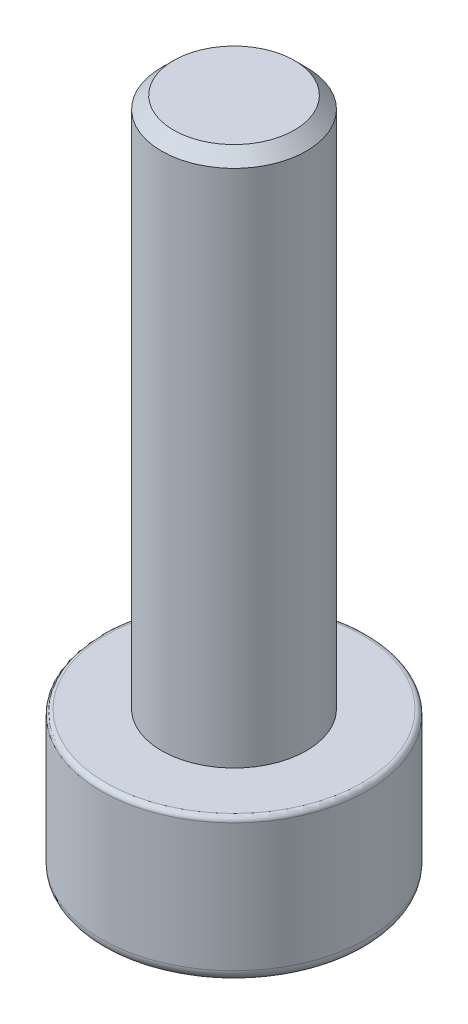
ISO-10303-21;
HEADER;
FILE_DESCRIPTION(('STEP AP214'),'2;1');
FILE_NAME('part.step','',(''),(''),'','','');
FILE_SCHEMA(('AUTOMOTIVE_DESIGN { 1 0 10303 214 1 1 1 1 }'));
ENDSEC;
DATA;
#1=APPLICATION_CONTEXT('core data for automotive mechanical design processes');
#2=APPLICATION_PROTOCOL_DEFINITION('international standard','automotive_design',2000,#1);
#3=PRODUCT_CONTEXT('',#1,'mechanical');
#4=PRODUCT('Part','Part','',(#3));
#5=PRODUCT_RELATED_PRODUCT_CATEGORY('part','',(#4));
#6=PRODUCT_DEFINITION_FORMATION('','',#4);
#7=PRODUCT_DEFINITION_CONTEXT('part definition',#1,'design');
#8=PRODUCT_DEFINITION('design','',#6,#7);
#9=PRODUCT_DEFINITION_SHAPE('','',#8);
#10=(LENGTH_UNIT() NAMED_UNIT(*) SI_UNIT(.MILLI.,.METRE.));
#11=(NAMED_UNIT(*) PLANE_ANGLE_UNIT() SI_UNIT($,.RADIAN.));
#12=(NAMED_UNIT(*) SI_UNIT($,.STERADIAN.) SOLID_ANGLE_UNIT());
#13=UNCERTAINTY_MEASURE_WITH_UNIT(LENGTH_MEASURE(1.E-05),#10,'distance_accuracy_value','');
#14=(GEOMETRIC_REPRESENTATION_CONTEXT(3) GLOBAL_UNCERTAINTY_ASSIGNED_CONTEXT((#13)) GLOBAL_UNIT_ASSIGNED_CONTEXT((#10,
#11,#12)) REPRESENTATION_CONTEXT('',''));
#15=CARTESIAN_POINT('',(0.,0.,0.));
#16=DIRECTION('',(0.,0.,1.));
#17=DIRECTION('',(1.,0.,0.));
#18=AXIS2_PLACEMENT_3D('',#15,#16,#17);
#19=CARTESIAN_POINT('',(0.,3.,0.));
#20=DIRECTION('',(0.,-1.,0.));
#21=DIRECTION('',(0.,0.,-1.));
#22=AXIS2_PLACEMENT_3D('',#19,#20,#21);
#23=CYLINDRICAL_SURFACE('',#22,2.75);
#24=CARTESIAN_POINT('',(0.,2.9,0.));
#25=DIRECTION('',(0.,1.,0.));
#26=DIRECTION('',(0.,0.,1.));
#27=AXIS2_PLACEMENT_3D('',#24,#25,#26);
#28=CIRCLE('',#27,2.75);
#29=CARTESIAN_POINT('',(0.,2.9,2.75));
#30=VERTEX_POINT('',#29);
#31=EDGE_CURVE('E11',#30,#30,#28,.F.);
#32=ORIENTED_EDGE('',*,*,#31,.T.);
#33=EDGE_LOOP('',(#32));
#34=FACE_BOUND('',#33,.T.);
#35=CARTESIAN_POINT('',(0.,0.25,0.));
#36=DIRECTION('',(0.,1.,0.));
#37=DIRECTION('',(0.,0.,1.));
#38=AXIS2_PLACEMENT_3D('',#35,#36,#37);
#39=CIRCLE('',#38,2.75);
#40=CARTESIAN_POINT('',(0.,0.25,2.75));
#41=VERTEX_POINT('',#40);
#42=EDGE_CURVE('E177',#41,#41,#39,.T.);
#43=ORIENTED_EDGE('',*,*,#42,.T.);
#44=EDGE_LOOP('',(#43));
#45=FACE_BOUND('',#44,.T.);
#46=ADVANCED_FACE('F33',(#34,#45),#23,.T.);
#47=CARTESIAN_POINT('',(0.,3.,0.));
#48=DIRECTION('',(0.,1.,0.));
#49=DIRECTION('',(0.,0.,1.));
#50=AXIS2_PLACEMENT_3D('',#47,#48,#49);
#51=PLANE('',#50);
#52=CARTESIAN_POINT('',(0.,3.,0.));
#53=DIRECTION('',(0.,1.,0.));
#54=DIRECTION('',(0.,0.,1.));
#55=AXIS2_PLACEMENT_3D('',#52,#53,#54);
#56=CIRCLE('',#55,2.65);
#57=CARTESIAN_POINT('',(0.,3.,2.65));
#58=VERTEX_POINT('',#57);
#59=EDGE_CURVE('E41',#58,#58,#56,.T.);
#60=ORIENTED_EDGE('',*,*,#59,.T.);
#61=EDGE_LOOP('',(#60));
#62=FACE_BOUND('',#61,.T.);
#63=CARTESIAN_POINT('',(0.,3.,0.));
#64=DIRECTION('',(0.,1.,0.));
#65=DIRECTION('',(0.,0.,1.));
#66=AXIS2_PLACEMENT_3D('',#63,#64,#65);
#67=CIRCLE('',#66,1.5);
#68=CARTESIAN_POINT('',(0.,3.,1.5));
#69=VERTEX_POINT('',#68);
#70=EDGE_CURVE('E141',#69,#69,#67,.T.);
#71=ORIENTED_EDGE('',*,*,#70,.F.);
#72=EDGE_LOOP('',(#71));
#73=FACE_BOUND('',#72,.T.);
#74=ADVANCED_FACE('F203',(#62,#73),#51,.T.);
#75=CARTESIAN_POINT('',(0.,0.,0.));
#76=DIRECTION('',(0.,1.,0.));
#77=DIRECTION('',(0.,0.,1.));
#78=AXIS2_PLACEMENT_3D('',#75,#76,#77);
#79=PLANE('',#78);
#80=CARTESIAN_POINT('',(0.,0.,0.));
#81=DIRECTION('',(0.,1.,0.));
#82=DIRECTION('',(0.,0.,1.));
#83=AXIS2_PLACEMENT_3D('',#80,#81,#82);
#84=CIRCLE('',#83,2.5);
#85=CARTESIAN_POINT('',(0.,0.,2.5));
#86=VERTEX_POINT('',#85);
#87=EDGE_CURVE('E192',#86,#86,#84,.F.);
#88=ORIENTED_EDGE('',*,*,#87,.T.);
#89=EDGE_LOOP('',(#88));
#90=FACE_BOUND('',#89,.T.);
#91=DIRECTION('',(-0.69197693122312,0.,-0.721919612321922));
#92=VECTOR('',#91,1.);
#93=CARTESIAN_POINT('',(1.02450088015783,0.,-0.982008194523007));
#94=LINE('',#93,#92);
#95=CARTESIAN_POINT('',(1.59146357561211,0.,-0.390512335578875));
#96=VERTEX_POINT('',#95);
#97=CARTESIAN_POINT('',(0.457538184703553,0.,-1.57350405346714));
#98=VERTEX_POINT('',#97);
#99=EDGE_CURVE('E156',#96,#98,#94,.T.);
#100=ORIENTED_EDGE('',*,*,#99,.T.);
#101=DIRECTION('',(-0.971189189372558,0.,0.238309795111058));
#102=VECTOR('',#101,1.);
#103=CARTESIAN_POINT('',(-0.3381936031025,0.,-1.3782478856777));
#104=LINE('',#103,#102);
#105=CARTESIAN_POINT('',(-1.13392539090855,0.,-1.18299171788826));
#106=VERTEX_POINT('',#105);
#107=EDGE_CURVE('E166',#98,#106,#104,.T.);
#108=ORIENTED_EDGE('',*,*,#107,.T.);
#109=DIRECTION('',(-0.279212258149438,0.,0.96022940743298));
#110=VECTOR('',#109,1.);
#111=CARTESIAN_POINT('',(-1.36269448326033,0.,-0.396239691154693));
#112=LINE('',#111,#110);
#113=CARTESIAN_POINT('',(-1.59146357561211,0.,0.390512335578876));
#114=VERTEX_POINT('',#113);
#115=EDGE_CURVE('E164',#106,#114,#112,.T.);
#116=ORIENTED_EDGE('',*,*,#115,.T.);
#117=DIRECTION('',(0.69197693122312,0.,0.721919612321922));
#118=VECTOR('',#117,1.);
#119=CARTESIAN_POINT('',(-1.02450088015783,0.,0.982008194523007));
#120=LINE('',#119,#118);
#121=CARTESIAN_POINT('',(-0.457538184703552,0.,1.57350405346714));
#122=VERTEX_POINT('',#121);
#123=EDGE_CURVE('E162',#114,#122,#120,.T.);
#124=ORIENTED_EDGE('',*,*,#123,.T.);
#125=DIRECTION('',(0.971189189372558,0.,-0.238309795111058));
#126=VECTOR('',#125,1.);
#127=CARTESIAN_POINT('',(0.3381936031025,0.,1.3782478856777));
#128=LINE('',#127,#126);
#129=CARTESIAN_POINT('',(1.13392539090855,0.,1.18299171788826));
#130=VERTEX_POINT('',#129);
#131=EDGE_CURVE('E160',#122,#130,#128,.T.);
#132=ORIENTED_EDGE('',*,*,#131,.T.);
#133=DIRECTION('',(0.279212258149438,0.,-0.96022940743298));
#134=VECTOR('',#133,1.);
#135=CARTESIAN_POINT('',(1.36269448326033,0.,0.396239691154694));
#136=LINE('',#135,#134);
#137=EDGE_CURVE('E158',#130,#96,#136,.T.);
#138=ORIENTED_EDGE('',*,*,#137,.T.);
#139=EDGE_LOOP('',(#100,#108,#116,#124,#132,#138));
#140=FACE_BOUND('',#139,.T.);
#141=ADVANCED_FACE('F221',(#90,#140),#79,.F.);
#142=CARTESIAN_POINT('',(0.,14.,0.));
#143=DIRECTION('',(0.,-1.,0.));
#144=DIRECTION('',(0.,0.,-1.));
#145=AXIS2_PLACEMENT_3D('',#142,#143,#144);
#146=CYLINDRICAL_SURFACE('',#145,1.5);
#147=CARTESIAN_POINT('',(0.,13.75,0.));
#148=DIRECTION('',(0.,1.,0.));
#149=DIRECTION('',(0.,0.,1.));
#150=AXIS2_PLACEMENT_3D('',#147,#148,#149);
#151=CIRCLE('',#150,1.5);
#152=CARTESIAN_POINT('',(0.,13.75,1.5));
#153=VERTEX_POINT('',#152);
#154=EDGE_CURVE('E198',#153,#153,#151,.F.);
#155=ORIENTED_EDGE('',*,*,#154,.T.);
#156=EDGE_LOOP('',(#155));
#157=FACE_BOUND('',#156,.T.);
#158=ORIENTED_EDGE('',*,*,#70,.T.);
#159=EDGE_LOOP('',(#158));
#160=FACE_BOUND('',#159,.T.);
#161=ADVANCED_FACE('F260',(#157,#160),#146,.T.);
#162=CARTESIAN_POINT('',(0.,14.,0.));
#163=DIRECTION('',(0.,1.,0.));
#164=DIRECTION('',(0.,0.,1.));
#165=AXIS2_PLACEMENT_3D('',#162,#163,#164);
#166=PLANE('',#165);
#167=CARTESIAN_POINT('',(0.,14.,0.));
#168=DIRECTION('',(0.,1.,0.));
#169=DIRECTION('',(0.,0.,1.));
#170=AXIS2_PLACEMENT_3D('',#167,#168,#169);
#171=CIRCLE('',#170,1.25);
#172=CARTESIAN_POINT('',(0.,14.,1.25));
#173=VERTEX_POINT('',#172);
#174=EDGE_CURVE('E195',#173,#173,#171,.T.);
#175=ORIENTED_EDGE('',*,*,#174,.T.);
#176=EDGE_LOOP('',(#175));
#177=FACE_BOUND('',#176,.T.);
#178=ADVANCED_FACE('F299',(#177),#166,.T.);
#179=CARTESIAN_POINT('',(1.31110540565295,1.5,-0.321718223399928));
#180=DIRECTION('',(0.96022940743298,0.,0.279212258149438));
#181=DIRECTION('',(0.279212258149438,0.,-0.96022940743298));
#182=AXIS2_PLACEMENT_3D('',#179,#180,#181);
#183=PLANE('',#182);
#184=DIRECTION('',(0.,-1.,0.));
#185=VECTOR('',#184,1.);
#186=CARTESIAN_POINT('',(1.31110540565295,1.5,-0.321718223399928));
#187=LINE('',#186,#185);
#188=CARTESIAN_POINT('',(1.31110540565295,1.5,-0.321718223399928));
#189=VERTEX_POINT('',#188);
#190=CARTESIAN_POINT('',(1.31110540565295,0.25,-0.321718223399928));
#191=VERTEX_POINT('',#190);
#192=EDGE_CURVE('E139',#189,#191,#187,.T.);
#193=ORIENTED_EDGE('',*,*,#192,.T.);
#194=DIRECTION('',(-0.279212258149438,0.,0.96022940743298));
#195=VECTOR('',#194,1.);
#196=CARTESIAN_POINT('',(1.31110540565295,0.25,-0.321718223399928));
#197=LINE('',#196,#195);
#198=CARTESIAN_POINT('',(0.934168857151212,0.25,0.974591476634595));
#199=VERTEX_POINT('',#198);
#200=EDGE_CURVE('E55',#191,#199,#197,.T.);
#201=ORIENTED_EDGE('',*,*,#200,.T.);
#202=DIRECTION('',(0.,-1.,0.));
#203=VECTOR('',#202,1.);
#204=CARTESIAN_POINT('',(0.934168857151212,1.5,0.974591476634595));
#205=LINE('',#204,#203);
#206=CARTESIAN_POINT('',(0.934168857151212,1.5,0.974591476634595));
#207=VERTEX_POINT('',#206);
#208=EDGE_CURVE('E103',#207,#199,#205,.T.);
#209=ORIENTED_EDGE('',*,*,#208,.F.);
#210=DIRECTION('',(-0.279212258149438,0.,0.96022940743298));
#211=VECTOR('',#210,1.);
#212=CARTESIAN_POINT('',(1.31110540565295,1.5,-0.321718223399928));
#213=LINE('',#212,#211);
#214=EDGE_CURVE('E107',#189,#207,#213,.T.);
#215=ORIENTED_EDGE('',*,*,#214,.F.);
#216=EDGE_LOOP('',(#193,#201,#209,#215));
#217=FACE_BOUND('',#216,.T.);
#218=ADVANCED_FACE('F105',(#217),#183,.F.);
#219=CARTESIAN_POINT('',(0.376936548501741,1.5,-1.29630970003452));
#220=DIRECTION('',(0.721919612321922,0.,-0.69197693122312));
#221=DIRECTION('',(-0.69197693122312,0.,-0.721919612321922));
#222=AXIS2_PLACEMENT_3D('',#219,#220,#221);
#223=PLANE('',#222);
#224=DIRECTION('',(0.,-1.,0.));
#225=VECTOR('',#224,1.);
#226=CARTESIAN_POINT('',(0.376936548501741,1.5,-1.29630970003452));
#227=LINE('',#226,#225);
#228=CARTESIAN_POINT('',(0.376936548501741,1.5,-1.29630970003452));
#229=VERTEX_POINT('',#228);
#230=CARTESIAN_POINT('',(0.376936548501741,0.25,-1.29630970003452));
#231=VERTEX_POINT('',#230);
#232=EDGE_CURVE('E142',#229,#231,#227,.T.);
#233=ORIENTED_EDGE('',*,*,#232,.T.);
#234=DIRECTION('',(0.69197693122312,0.,0.721919612321922));
#235=VECTOR('',#234,1.);
#236=CARTESIAN_POINT('',(0.376936548501741,0.25,-1.29630970003452));
#237=LINE('',#236,#235);
#238=EDGE_CURVE('E48',#231,#191,#237,.T.);
#239=ORIENTED_EDGE('',*,*,#238,.T.);
#240=ORIENTED_EDGE('',*,*,#192,.F.);
#241=DIRECTION('',(0.69197693122312,0.,0.721919612321922));
#242=VECTOR('',#241,1.);
#243=CARTESIAN_POINT('',(0.376936548501741,1.5,-1.29630970003452));
#244=LINE('',#243,#242);
#245=EDGE_CURVE('E112',#229,#189,#244,.T.);
#246=ORIENTED_EDGE('',*,*,#245,.F.);
#247=EDGE_LOOP('',(#233,#239,#240,#246));
#248=FACE_BOUND('',#247,.T.);
#249=ADVANCED_FACE('F272',(#248),#223,.F.);
#250=CARTESIAN_POINT('',(-0.934168857151211,1.5,-0.974591476634595));
#251=DIRECTION('',(-0.238309795111058,0.,-0.971189189372557));
#252=DIRECTION('',(-0.971189189372558,0.,0.238309795111058));
#253=AXIS2_PLACEMENT_3D('',#250,#251,#252);
#254=PLANE('',#253);
#255=DIRECTION('',(0.,-1.,0.));
#256=VECTOR('',#255,1.);
#257=CARTESIAN_POINT('',(-0.934168857151211,1.5,-0.974591476634595));
#258=LINE('',#257,#256);
#259=CARTESIAN_POINT('',(-0.934168857151211,1.5,-0.974591476634595));
#260=VERTEX_POINT('',#259);
#261=CARTESIAN_POINT('',(-0.934168857151211,0.25,-0.974591476634595));
#262=VERTEX_POINT('',#261);
#263=EDGE_CURVE('E144',#260,#262,#258,.T.);
#264=ORIENTED_EDGE('',*,*,#263,.T.);
#265=DIRECTION('',(0.971189189372558,0.,-0.238309795111058));
#266=VECTOR('',#265,1.);
#267=CARTESIAN_POINT('',(-0.934168857151211,0.25,-0.974591476634595));
#268=LINE('',#267,#266);
#269=EDGE_CURVE('E153',#262,#231,#268,.T.);
#270=ORIENTED_EDGE('',*,*,#269,.T.);
#271=ORIENTED_EDGE('',*,*,#232,.F.);
#272=DIRECTION('',(0.971189189372558,0.,-0.238309795111058));
#273=VECTOR('',#272,1.);
#274=CARTESIAN_POINT('',(-0.934168857151211,1.5,-0.974591476634595));
#275=LINE('',#274,#273);
#276=EDGE_CURVE('E136',#260,#229,#275,.T.);
#277=ORIENTED_EDGE('',*,*,#276,.F.);
#278=EDGE_LOOP('',(#264,#270,#271,#277));
#279=FACE_BOUND('',#278,.T.);
#280=ADVANCED_FACE('F270',(#279),#254,.F.);
#281=CARTESIAN_POINT('',(-1.31110540565295,1.5,0.321718223399928));
#282=DIRECTION('',(-0.96022940743298,0.,-0.279212258149438));
#283=DIRECTION('',(-0.279212258149438,0.,0.96022940743298));
#284=AXIS2_PLACEMENT_3D('',#281,#282,#283);
#285=PLANE('',#284);
#286=DIRECTION('',(0.,-1.,0.));
#287=VECTOR('',#286,1.);
#288=CARTESIAN_POINT('',(-1.31110540565295,1.5,0.321718223399928));
#289=LINE('',#288,#287);
#290=CARTESIAN_POINT('',(-1.31110540565295,1.5,0.321718223399928));
#291=VERTEX_POINT('',#290);
#292=CARTESIAN_POINT('',(-1.31110540565295,0.25,0.321718223399928));
#293=VERTEX_POINT('',#292);
#294=EDGE_CURVE('E147',#291,#293,#289,.T.);
#295=ORIENTED_EDGE('',*,*,#294,.T.);
#296=DIRECTION('',(0.279212258149438,0.,-0.96022940743298));
#297=VECTOR('',#296,1.);
#298=CARTESIAN_POINT('',(-1.31110540565295,0.25,0.321718223399928));
#299=LINE('',#298,#297);
#300=EDGE_CURVE('E169',#293,#262,#299,.T.);
#301=ORIENTED_EDGE('',*,*,#300,.T.);
#302=ORIENTED_EDGE('',*,*,#263,.F.);
#303=DIRECTION('',(0.279212258149438,0.,-0.96022940743298));
#304=VECTOR('',#303,1.);
#305=CARTESIAN_POINT('',(-1.31110540565295,1.5,0.321718223399928));
#306=LINE('',#305,#304);
#307=EDGE_CURVE('E133',#291,#260,#306,.T.);
#308=ORIENTED_EDGE('',*,*,#307,.F.);
#309=EDGE_LOOP('',(#295,#301,#302,#308));
#310=FACE_BOUND('',#309,.T.);
#311=ADVANCED_FACE('F281',(#310),#285,.F.);
#312=CARTESIAN_POINT('',(-0.376936548501741,1.5,1.29630970003452));
#313=DIRECTION('',(-0.721919612321922,0.,0.69197693122312));
#314=DIRECTION('',(0.69197693122312,0.,0.721919612321922));
#315=AXIS2_PLACEMENT_3D('',#312,#313,#314);
#316=PLANE('',#315);
#317=DIRECTION('',(0.,-1.,0.));
#318=VECTOR('',#317,1.);
#319=CARTESIAN_POINT('',(-0.376936548501741,1.5,1.29630970003452));
#320=LINE('',#319,#318);
#321=CARTESIAN_POINT('',(-0.376936548501741,1.5,1.29630970003452));
#322=VERTEX_POINT('',#321);
#323=CARTESIAN_POINT('',(-0.376936548501741,0.25,1.29630970003452));
#324=VERTEX_POINT('',#323);
#325=EDGE_CURVE('E111',#322,#324,#320,.T.);
#326=ORIENTED_EDGE('',*,*,#325,.T.);
#327=DIRECTION('',(-0.69197693122312,0.,-0.721919612321922));
#328=VECTOR('',#327,1.);
#329=CARTESIAN_POINT('',(-0.376936548501741,0.25,1.29630970003452));
#330=LINE('',#329,#328);
#331=EDGE_CURVE('E171',#324,#293,#330,.T.);
#332=ORIENTED_EDGE('',*,*,#331,.T.);
#333=ORIENTED_EDGE('',*,*,#294,.F.);
#334=DIRECTION('',(-0.69197693122312,0.,-0.721919612321922));
#335=VECTOR('',#334,1.);
#336=CARTESIAN_POINT('',(-0.376936548501741,1.5,1.29630970003452));
#337=LINE('',#336,#335);
#338=EDGE_CURVE('E121',#322,#291,#337,.T.);
#339=ORIENTED_EDGE('',*,*,#338,.F.);
#340=EDGE_LOOP('',(#326,#332,#333,#339));
#341=FACE_BOUND('',#340,.T.);
#342=ADVANCED_FACE('F278',(#341),#316,.F.);
#343=CARTESIAN_POINT('',(0.934168857151212,1.5,0.974591476634595));
#344=DIRECTION('',(0.238309795111058,0.,0.971189189372558));
#345=DIRECTION('',(0.971189189372558,0.,-0.238309795111058));
#346=AXIS2_PLACEMENT_3D('',#343,#344,#345);
#347=PLANE('',#346);
#348=ORIENTED_EDGE('',*,*,#208,.T.);
#349=DIRECTION('',(-0.971189189372558,0.,0.238309795111058));
#350=VECTOR('',#349,1.);
#351=CARTESIAN_POINT('',(0.934168857151212,0.25,0.974591476634595));
#352=LINE('',#351,#350);
#353=EDGE_CURVE('E173',#199,#324,#352,.T.);
#354=ORIENTED_EDGE('',*,*,#353,.T.);
#355=ORIENTED_EDGE('',*,*,#325,.F.);
#356=DIRECTION('',(-0.971189189372557,0.,0.238309795111058));
#357=VECTOR('',#356,1.);
#358=CARTESIAN_POINT('',(0.934168857151212,1.5,0.974591476634595));
#359=LINE('',#358,#357);
#360=EDGE_CURVE('E115',#207,#322,#359,.T.);
#361=ORIENTED_EDGE('',*,*,#360,.F.);
#362=EDGE_LOOP('',(#348,#354,#355,#361));
#363=FACE_BOUND('',#362,.T.);
#364=ADVANCED_FACE('F116',(#363),#347,.F.);
#365=CARTESIAN_POINT('',(0.,1.5,0.));
#366=DIRECTION('',(0.,-1.,0.));
#367=DIRECTION('',(0.,0.,-1.));
#368=AXIS2_PLACEMENT_3D('',#365,#366,#367);
#369=PLANE('',#368);
#370=ORIENTED_EDGE('',*,*,#214,.T.);
#371=ORIENTED_EDGE('',*,*,#360,.T.);
#372=ORIENTED_EDGE('',*,*,#338,.T.);
#373=ORIENTED_EDGE('',*,*,#307,.T.);
#374=ORIENTED_EDGE('',*,*,#276,.T.);
#375=ORIENTED_EDGE('',*,*,#245,.T.);
#376=EDGE_LOOP('',(#370,#371,#372,#373,#374,#375));
#377=FACE_BOUND('',#376,.T.);
#378=ADVANCED_FACE('F123',(#377),#369,.T.);
#379=CARTESIAN_POINT('',(0.934168857151212,0.25,0.974591476634595));
#380=DIRECTION('',(0.168510472146205,0.70710678118655,0.686734461620399));
#381=DIRECTION('',(-0.971189189372558,0.,0.238309795111058));
#382=AXIS2_PLACEMENT_3D('',#379,#380,#381);
#383=PLANE('',#382);
#384=DIRECTION('',(-0.52308539228858,0.654653670707974,-0.545719931652563));
#385=VECTOR('',#384,1.);
#386=CARTESIAN_POINT('',(0.934168857151212,0.25,0.974591476634595));
#387=LINE('',#386,#385);
#388=EDGE_CURVE('E129',#130,#199,#387,.T.);
#389=ORIENTED_EDGE('',*,*,#388,.F.);
#390=ORIENTED_EDGE('',*,*,#131,.F.);
#391=DIRECTION('',(0.211064628018338,0.654653670707974,-0.72586520389674));
#392=VECTOR('',#391,1.);
#393=CARTESIAN_POINT('',(-0.376936548501741,0.25,1.29630970003452));
#394=LINE('',#393,#392);
#395=EDGE_CURVE('E126',#324,#122,#394,.F.);
#396=ORIENTED_EDGE('',*,*,#395,.F.);
#397=ORIENTED_EDGE('',*,*,#353,.F.);
#398=EDGE_LOOP('',(#389,#390,#396,#397));
#399=FACE_BOUND('',#398,.T.);
#400=ADVANCED_FACE('F245',(#399),#383,.F.);
#401=CARTESIAN_POINT('',(-0.376936548501741,0.25,1.29630970003452));
#402=DIRECTION('',(-0.510474253344393,0.70710678118655,0.489301580492523));
#403=DIRECTION('',(-0.69197693122312,0.,-0.721919612321922));
#404=AXIS2_PLACEMENT_3D('',#401,#402,#403);
#405=PLANE('',#404);
#406=ORIENTED_EDGE('',*,*,#395,.T.);
#407=ORIENTED_EDGE('',*,*,#123,.F.);
#408=DIRECTION('',(0.734150020306917,0.654653670707974,-0.180145272244176));
#409=VECTOR('',#408,1.);
#410=CARTESIAN_POINT('',(-1.31110540565295,0.25,0.321718223399928));
#411=LINE('',#410,#409);
#412=EDGE_CURVE('E185',#293,#114,#411,.F.);
#413=ORIENTED_EDGE('',*,*,#412,.F.);
#414=ORIENTED_EDGE('',*,*,#331,.F.);
#415=EDGE_LOOP('',(#406,#407,#413,#414));
#416=FACE_BOUND('',#415,.T.);
#417=ADVANCED_FACE('F241',(#416),#405,.F.);
#418=CARTESIAN_POINT('',(1.31110540565295,0.25,-0.321718223399928));
#419=DIRECTION('',(0.678984725490597,0.707106781186551,0.197432881127876));
#420=DIRECTION('',(-0.279212258149438,0.,0.96022940743298));
#421=AXIS2_PLACEMENT_3D('',#418,#419,#420);
#422=PLANE('',#421);
#423=ORIENTED_EDGE('',*,*,#388,.T.);
#424=ORIENTED_EDGE('',*,*,#200,.F.);
#425=DIRECTION('',(-0.734150020306917,0.654653670707974,0.180145272244176));
#426=VECTOR('',#425,1.);
#427=CARTESIAN_POINT('',(1.31110540565295,0.25,-0.321718223399928));
#428=LINE('',#427,#426);
#429=EDGE_CURVE('E182',#96,#191,#428,.T.);
#430=ORIENTED_EDGE('',*,*,#429,.F.);
#431=ORIENTED_EDGE('',*,*,#137,.F.);
#432=EDGE_LOOP('',(#423,#424,#430,#431));
#433=FACE_BOUND('',#432,.T.);
#434=ADVANCED_FACE('F237',(#433),#422,.F.);
#435=CARTESIAN_POINT('',(-1.31110540565295,0.25,0.321718223399928));
#436=DIRECTION('',(-0.678984725490598,0.70710678118655,-0.197432881127876));
#437=DIRECTION('',(0.279212258149438,0.,-0.96022940743298));
#438=AXIS2_PLACEMENT_3D('',#435,#436,#437);
#439=PLANE('',#438);
#440=ORIENTED_EDGE('',*,*,#412,.T.);
#441=ORIENTED_EDGE('',*,*,#115,.F.);
#442=DIRECTION('',(0.523085392288579,0.654653670707974,0.545719931652563));
#443=VECTOR('',#442,1.);
#444=CARTESIAN_POINT('',(-0.934168857151211,0.25,-0.974591476634595));
#445=LINE('',#444,#443);
#446=EDGE_CURVE('E180',#262,#106,#445,.F.);
#447=ORIENTED_EDGE('',*,*,#446,.F.);
#448=ORIENTED_EDGE('',*,*,#300,.F.);
#449=EDGE_LOOP('',(#440,#441,#447,#448));
#450=FACE_BOUND('',#449,.T.);
#451=ADVANCED_FACE('F233',(#450),#439,.F.);
#452=CARTESIAN_POINT('',(0.376936548501741,0.25,-1.29630970003452));
#453=DIRECTION('',(0.510474253344392,0.70710678118655,-0.489301580492523));
#454=DIRECTION('',(0.69197693122312,0.,0.721919612321922));
#455=AXIS2_PLACEMENT_3D('',#452,#453,#454);
#456=PLANE('',#455);
#457=ORIENTED_EDGE('',*,*,#429,.T.);
#458=ORIENTED_EDGE('',*,*,#238,.F.);
#459=DIRECTION('',(0.211064628018338,-0.654653670707974,-0.72586520389674));
#460=VECTOR('',#459,1.);
#461=CARTESIAN_POINT('',(0.269240391786957,0.584038370031141,-0.925935500024657));
#462=LINE('',#461,#460);
#463=EDGE_CURVE('E178',#98,#231,#462,.F.);
#464=ORIENTED_EDGE('',*,*,#463,.F.);
#465=ORIENTED_EDGE('',*,*,#99,.F.);
#466=EDGE_LOOP('',(#457,#458,#464,#465));
#467=FACE_BOUND('',#466,.T.);
#468=ADVANCED_FACE('F229',(#467),#456,.F.);
#469=CARTESIAN_POINT('',(-0.934168857151211,0.25,-0.974591476634595));
#470=DIRECTION('',(-0.168510472146205,0.70710678118655,-0.686734461620399));
#471=DIRECTION('',(0.971189189372558,0.,-0.238309795111058));
#472=AXIS2_PLACEMENT_3D('',#469,#470,#471);
#473=PLANE('',#472);
#474=ORIENTED_EDGE('',*,*,#446,.T.);
#475=ORIENTED_EDGE('',*,*,#107,.F.);
#476=ORIENTED_EDGE('',*,*,#463,.T.);
#477=ORIENTED_EDGE('',*,*,#269,.F.);
#478=EDGE_LOOP('',(#474,#475,#476,#477));
#479=FACE_BOUND('',#478,.T.);
#480=ADVANCED_FACE('F226',(#479),#473,.F.);
#481=CARTESIAN_POINT('',(0.,0.25,0.));
#482=DIRECTION('',(0.,1.,0.));
#483=DIRECTION('',(0.,0.,1.));
#484=AXIS2_PLACEMENT_3D('',#481,#482,#483);
#485=TOROIDAL_SURFACE('',#484,2.5,0.25);
#486=ORIENTED_EDGE('',*,*,#87,.F.);
#487=EDGE_LOOP('',(#486));
#488=FACE_BOUND('',#487,.T.);
#489=ORIENTED_EDGE('',*,*,#42,.F.);
#490=EDGE_LOOP('',(#489));
#491=FACE_BOUND('',#490,.T.);
#492=ADVANCED_FACE('F212',(#488,#491),#485,.T.);
#493=CARTESIAN_POINT('',(0.,14.,0.));
#494=DIRECTION('',(0.,-1.,0.));
#495=DIRECTION('',(0.,0.,-1.));
#496=AXIS2_PLACEMENT_3D('',#493,#494,#495);
#497=CONICAL_SURFACE('',#496,1.25,0.78539816339745);
#498=ORIENTED_EDGE('',*,*,#154,.F.);
#499=EDGE_LOOP('',(#498));
#500=FACE_BOUND('',#499,.T.);
#501=ORIENTED_EDGE('',*,*,#174,.F.);
#502=EDGE_LOOP('',(#501));
#503=FACE_BOUND('',#502,.T.);
#504=ADVANCED_FACE('F207',(#500,#503),#497,.T.);
#505=CARTESIAN_POINT('',(0.,2.9,0.));
#506=DIRECTION('',(0.,1.,0.));
#507=DIRECTION('',(0.,0.,1.));
#508=AXIS2_PLACEMENT_3D('',#505,#506,#507);
#509=TOROIDAL_SURFACE('',#508,2.65,0.1);
#510=ORIENTED_EDGE('',*,*,#31,.F.);
#511=EDGE_LOOP('',(#510));
#512=FACE_BOUND('',#511,.T.);
#513=ORIENTED_EDGE('',*,*,#59,.F.);
#514=EDGE_LOOP('',(#513));
#515=FACE_BOUND('',#514,.T.);
#516=ADVANCED_FACE('F35',(#512,#515),#509,.T.);
#517=CLOSED_SHELL('',(#46,#74,#141,#161,#178,#218,#249,#280,#311,#342,#364,#378,#400,#417,#434,
#451,#468,#480,#492,#504,#516));
#518=MANIFOLD_SOLID_BREP('B2',#517);
#519=ADVANCED_BREP_SHAPE_REPRESENTATION('',(#18,#518),#14);
#520=SHAPE_DEFINITION_REPRESENTATION(#9,#519);
ENDSEC;
END-ISO-10303-21;
